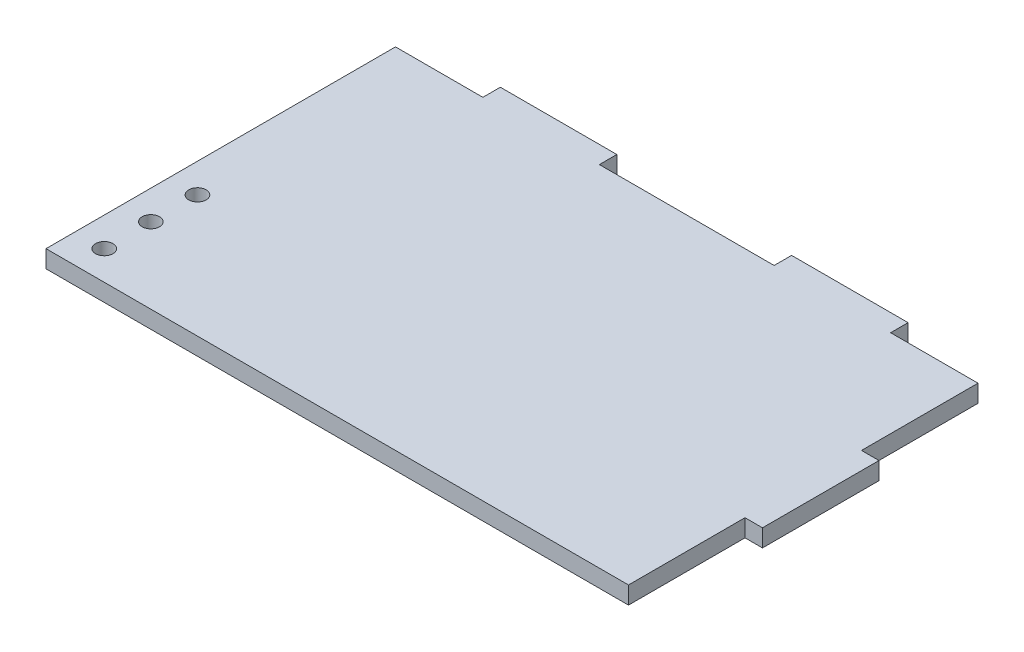
ISO-10303-21;
HEADER;
FILE_DESCRIPTION(('STEP AP214'),'2;1');
FILE_NAME('part.step','',(''),(''),'','','');
FILE_SCHEMA(('AUTOMOTIVE_DESIGN { 1 0 10303 214 1 1 1 1 }'));
ENDSEC;
DATA;
#1=APPLICATION_CONTEXT('core data for automotive mechanical design processes');
#2=APPLICATION_PROTOCOL_DEFINITION('international standard','automotive_design',2000,#1);
#3=PRODUCT_CONTEXT('',#1,'mechanical');
#4=PRODUCT('Part','Part','',(#3));
#5=PRODUCT_RELATED_PRODUCT_CATEGORY('part','',(#4));
#6=PRODUCT_DEFINITION_FORMATION('','',#4);
#7=PRODUCT_DEFINITION_CONTEXT('part definition',#1,'design');
#8=PRODUCT_DEFINITION('design','',#6,#7);
#9=PRODUCT_DEFINITION_SHAPE('','',#8);
#10=(LENGTH_UNIT() NAMED_UNIT(*) SI_UNIT(.MILLI.,.METRE.));
#11=(NAMED_UNIT(*) PLANE_ANGLE_UNIT() SI_UNIT($,.RADIAN.));
#12=(NAMED_UNIT(*) SI_UNIT($,.STERADIAN.) SOLID_ANGLE_UNIT());
#13=UNCERTAINTY_MEASURE_WITH_UNIT(LENGTH_MEASURE(1.E-05),#10,'distance_accuracy_value','');
#14=(GEOMETRIC_REPRESENTATION_CONTEXT(3) GLOBAL_UNCERTAINTY_ASSIGNED_CONTEXT((#13)) GLOBAL_UNIT_ASSIGNED_CONTEXT((#10,
#11,#12)) REPRESENTATION_CONTEXT('',''));
#15=CARTESIAN_POINT('',(0.,0.,0.));
#16=DIRECTION('',(0.,0.,1.));
#17=DIRECTION('',(1.,0.,0.));
#18=AXIS2_PLACEMENT_3D('',#15,#16,#17);
#19=CARTESIAN_POINT('',(0.,94.5,0.));
#20=DIRECTION('',(0.,1.,0.));
#21=DIRECTION('',(0.,0.,1.));
#22=AXIS2_PLACEMENT_3D('',#19,#20,#21);
#23=PLANE('',#22);
#24=CARTESIAN_POINT('',(6.99999999999994,94.5,-152.));
#25=DIRECTION('',(0.,1.,0.));
#26=DIRECTION('',(0.,0.,1.));
#27=AXIS2_PLACEMENT_3D('',#24,#25,#26);
#28=CIRCLE('',#27,1.5);
#29=CARTESIAN_POINT('',(6.99999999999994,94.5,-150.5));
#30=VERTEX_POINT('',#29);
#31=EDGE_CURVE('E337',#30,#30,#28,.T.);
#32=ORIENTED_EDGE('',*,*,#31,.F.);
#33=EDGE_LOOP('',(#32));
#34=FACE_BOUND('',#33,.T.);
#35=DIRECTION('',(0.,0.,-1.));
#36=VECTOR('',#35,1.);
#37=CARTESIAN_POINT('',(102.,94.5,-207.));
#38=LINE('',#37,#36);
#39=CARTESIAN_POINT('',(102.,94.5,-187.));
#40=VERTEX_POINT('',#39);
#41=CARTESIAN_POINT('',(102.,94.5,-207.));
#42=VERTEX_POINT('',#41);
#43=EDGE_CURVE('E208',#40,#42,#38,.T.);
#44=ORIENTED_EDGE('',*,*,#43,.T.);
#45=DIRECTION('',(-1.,0.,0.));
#46=VECTOR('',#45,1.);
#47=CARTESIAN_POINT('',(102.,94.5,-207.));
#48=LINE('',#47,#46);
#49=CARTESIAN_POINT('',(86.9999999999999,94.5,-207.));
#50=VERTEX_POINT('',#49);
#51=EDGE_CURVE('E116',#42,#50,#48,.T.);
#52=ORIENTED_EDGE('',*,*,#51,.T.);
#53=DIRECTION('',(0.,0.,-1.));
#54=VECTOR('',#53,1.);
#55=CARTESIAN_POINT('',(86.9999999999999,94.5,-207.));
#56=LINE('',#55,#54);
#57=CARTESIAN_POINT('',(86.9999999999999,94.5,-210.));
#58=VERTEX_POINT('',#57);
#59=EDGE_CURVE('E247',#50,#58,#56,.T.);
#60=ORIENTED_EDGE('',*,*,#59,.T.);
#61=DIRECTION('',(-1.,0.,0.));
#62=VECTOR('',#61,1.);
#63=CARTESIAN_POINT('',(86.9999999999999,94.5,-210.));
#64=LINE('',#63,#62);
#65=CARTESIAN_POINT('',(66.9999999999999,94.5,-210.));
#66=VERTEX_POINT('',#65);
#67=EDGE_CURVE('E266',#58,#66,#64,.T.);
#68=ORIENTED_EDGE('',*,*,#67,.T.);
#69=DIRECTION('',(0.,0.,1.));
#70=VECTOR('',#69,1.);
#71=CARTESIAN_POINT('',(66.9999999999999,94.5,-207.));
#72=LINE('',#71,#70);
#73=CARTESIAN_POINT('',(66.9999999999999,94.5,-207.));
#74=VERTEX_POINT('',#73);
#75=EDGE_CURVE('E263',#66,#74,#72,.T.);
#76=ORIENTED_EDGE('',*,*,#75,.T.);
#77=DIRECTION('',(-1.,0.,0.));
#78=VECTOR('',#77,1.);
#79=CARTESIAN_POINT('',(66.9999999999999,94.5,-207.));
#80=LINE('',#79,#78);
#81=CARTESIAN_POINT('',(36.9999999999999,94.5,-207.));
#82=VERTEX_POINT('',#81);
#83=EDGE_CURVE('E265',#74,#82,#80,.T.);
#84=ORIENTED_EDGE('',*,*,#83,.T.);
#85=DIRECTION('',(0.,0.,-1.));
#86=VECTOR('',#85,1.);
#87=CARTESIAN_POINT('',(36.9999999999999,94.5,-207.));
#88=LINE('',#87,#86);
#89=CARTESIAN_POINT('',(36.9999999999999,94.5,-210.));
#90=VERTEX_POINT('',#89);
#91=EDGE_CURVE('E268',#82,#90,#88,.T.);
#92=ORIENTED_EDGE('',*,*,#91,.T.);
#93=DIRECTION('',(-1.,0.,0.));
#94=VECTOR('',#93,1.);
#95=CARTESIAN_POINT('',(16.9999999999999,94.5,-210.));
#96=LINE('',#95,#94);
#97=CARTESIAN_POINT('',(16.9999999999999,94.5,-210.));
#98=VERTEX_POINT('',#97);
#99=EDGE_CURVE('E274',#90,#98,#96,.T.);
#100=ORIENTED_EDGE('',*,*,#99,.T.);
#101=DIRECTION('',(0.,0.,1.));
#102=VECTOR('',#101,1.);
#103=CARTESIAN_POINT('',(16.9999999999999,94.5,-207.));
#104=LINE('',#103,#102);
#105=CARTESIAN_POINT('',(16.9999999999999,94.5,-207.));
#106=VERTEX_POINT('',#105);
#107=EDGE_CURVE('E276',#98,#106,#104,.T.);
#108=ORIENTED_EDGE('',*,*,#107,.T.);
#109=DIRECTION('',(-1.,0.,0.));
#110=VECTOR('',#109,1.);
#111=CARTESIAN_POINT('',(16.9999999999999,94.5,-207.));
#112=LINE('',#111,#110);
#113=CARTESIAN_POINT('',(1.99999999999993,94.5,-207.));
#114=VERTEX_POINT('',#113);
#115=EDGE_CURVE('E278',#106,#114,#112,.T.);
#116=ORIENTED_EDGE('',*,*,#115,.T.);
#117=DIRECTION('',(0.,0.,1.));
#118=VECTOR('',#117,1.);
#119=CARTESIAN_POINT('',(1.99999999999993,94.5,-207.));
#120=LINE('',#119,#118);
#121=CARTESIAN_POINT('',(1.99999999999993,94.5,-147.));
#122=VERTEX_POINT('',#121);
#123=EDGE_CURVE('E280',#114,#122,#120,.T.);
#124=ORIENTED_EDGE('',*,*,#123,.T.);
#125=DIRECTION('',(1.,0.,0.));
#126=VECTOR('',#125,1.);
#127=CARTESIAN_POINT('',(102.,94.5,-147.));
#128=LINE('',#127,#126);
#129=CARTESIAN_POINT('',(102.,94.5,-147.));
#130=VERTEX_POINT('',#129);
#131=EDGE_CURVE('E282',#122,#130,#128,.T.);
#132=ORIENTED_EDGE('',*,*,#131,.T.);
#133=DIRECTION('',(0.,0.,-1.));
#134=VECTOR('',#133,1.);
#135=CARTESIAN_POINT('',(102.,94.5,-167.));
#136=LINE('',#135,#134);
#137=CARTESIAN_POINT('',(102.,94.5,-167.));
#138=VERTEX_POINT('',#137);
#139=EDGE_CURVE('E159',#130,#138,#136,.T.);
#140=ORIENTED_EDGE('',*,*,#139,.T.);
#141=DIRECTION('',(1.,0.,0.));
#142=VECTOR('',#141,1.);
#143=CARTESIAN_POINT('',(102.,94.5,-167.));
#144=LINE('',#143,#142);
#145=CARTESIAN_POINT('',(105.,94.5,-167.));
#146=VERTEX_POINT('',#145);
#147=EDGE_CURVE('E153',#138,#146,#144,.T.);
#148=ORIENTED_EDGE('',*,*,#147,.T.);
#149=DIRECTION('',(0.,0.,-1.));
#150=VECTOR('',#149,1.);
#151=CARTESIAN_POINT('',(105.,94.5,-187.));
#152=LINE('',#151,#150);
#153=CARTESIAN_POINT('',(105.,94.5,-187.));
#154=VERTEX_POINT('',#153);
#155=EDGE_CURVE('E157',#146,#154,#152,.T.);
#156=ORIENTED_EDGE('',*,*,#155,.T.);
#157=DIRECTION('',(-1.,0.,0.));
#158=VECTOR('',#157,1.);
#159=CARTESIAN_POINT('',(102.,94.5,-187.));
#160=LINE('',#159,#158);
#161=EDGE_CURVE('E49',#154,#40,#160,.T.);
#162=ORIENTED_EDGE('',*,*,#161,.T.);
#163=EDGE_LOOP('',(#44,#52,#60,#68,#76,#84,#92,#100,#108,#116,#124,#132,#140,#148,#156,#162));
#164=FACE_BOUND('',#163,.T.);
#165=CARTESIAN_POINT('',(6.99999999999992,94.5,-160.));
#166=DIRECTION('',(0.,1.,0.));
#167=DIRECTION('',(0.,0.,1.));
#168=AXIS2_PLACEMENT_3D('',#165,#166,#167);
#169=CIRCLE('',#168,1.5);
#170=CARTESIAN_POINT('',(6.99999999999992,94.5,-158.5));
#171=VERTEX_POINT('',#170);
#172=EDGE_CURVE('E181',#171,#171,#169,.T.);
#173=ORIENTED_EDGE('',*,*,#172,.F.);
#174=EDGE_LOOP('',(#173));
#175=FACE_BOUND('',#174,.T.);
#176=CARTESIAN_POINT('',(6.99999999999992,94.5,-168.));
#177=DIRECTION('',(0.,1.,0.));
#178=DIRECTION('',(0.,0.,1.));
#179=AXIS2_PLACEMENT_3D('',#176,#177,#178);
#180=CIRCLE('',#179,1.5);
#181=CARTESIAN_POINT('',(6.99999999999992,94.5,-166.5));
#182=VERTEX_POINT('',#181);
#183=EDGE_CURVE('E328',#182,#182,#180,.T.);
#184=ORIENTED_EDGE('',*,*,#183,.F.);
#185=EDGE_LOOP('',(#184));
#186=FACE_BOUND('',#185,.T.);
#187=ADVANCED_FACE('F32',(#34,#164,#175,#186),#23,.T.);
#188=CARTESIAN_POINT('',(0.,91.5,0.));
#189=DIRECTION('',(0.,1.,0.));
#190=DIRECTION('',(0.,0.,1.));
#191=AXIS2_PLACEMENT_3D('',#188,#189,#190);
#192=PLANE('',#191);
#193=DIRECTION('',(0.,0.,-1.));
#194=VECTOR('',#193,1.);
#195=CARTESIAN_POINT('',(102.,91.5,-207.));
#196=LINE('',#195,#194);
#197=CARTESIAN_POINT('',(102.,91.5,-187.));
#198=VERTEX_POINT('',#197);
#199=CARTESIAN_POINT('',(102.,91.5,-207.));
#200=VERTEX_POINT('',#199);
#201=EDGE_CURVE('E177',#198,#200,#196,.T.);
#202=ORIENTED_EDGE('',*,*,#201,.F.);
#203=DIRECTION('',(-1.,0.,0.));
#204=VECTOR('',#203,1.);
#205=CARTESIAN_POINT('',(102.,91.5,-187.));
#206=LINE('',#205,#204);
#207=CARTESIAN_POINT('',(105.,91.5,-187.));
#208=VERTEX_POINT('',#207);
#209=EDGE_CURVE('E108',#208,#198,#206,.T.);
#210=ORIENTED_EDGE('',*,*,#209,.F.);
#211=DIRECTION('',(0.,0.,-1.));
#212=VECTOR('',#211,1.);
#213=CARTESIAN_POINT('',(105.,91.5,-187.));
#214=LINE('',#213,#212);
#215=CARTESIAN_POINT('',(105.,91.5,-167.));
#216=VERTEX_POINT('',#215);
#217=EDGE_CURVE('E102',#216,#208,#214,.T.);
#218=ORIENTED_EDGE('',*,*,#217,.F.);
#219=DIRECTION('',(1.,0.,0.));
#220=VECTOR('',#219,1.);
#221=CARTESIAN_POINT('',(102.,91.5,-167.));
#222=LINE('',#221,#220);
#223=CARTESIAN_POINT('',(102.,91.5,-167.));
#224=VERTEX_POINT('',#223);
#225=EDGE_CURVE('E167',#224,#216,#222,.T.);
#226=ORIENTED_EDGE('',*,*,#225,.F.);
#227=DIRECTION('',(0.,0.,-1.));
#228=VECTOR('',#227,1.);
#229=CARTESIAN_POINT('',(102.,91.5,-167.));
#230=LINE('',#229,#228);
#231=CARTESIAN_POINT('',(102.,91.5,-147.));
#232=VERTEX_POINT('',#231);
#233=EDGE_CURVE('E203',#232,#224,#230,.T.);
#234=ORIENTED_EDGE('',*,*,#233,.F.);
#235=DIRECTION('',(1.,0.,0.));
#236=VECTOR('',#235,1.);
#237=CARTESIAN_POINT('',(102.,91.5,-147.));
#238=LINE('',#237,#236);
#239=CARTESIAN_POINT('',(1.99999999999993,91.5,-147.));
#240=VERTEX_POINT('',#239);
#241=EDGE_CURVE('E201',#240,#232,#238,.T.);
#242=ORIENTED_EDGE('',*,*,#241,.F.);
#243=DIRECTION('',(0.,0.,1.));
#244=VECTOR('',#243,1.);
#245=CARTESIAN_POINT('',(1.99999999999993,91.5,-207.));
#246=LINE('',#245,#244);
#247=CARTESIAN_POINT('',(1.99999999999993,91.5,-207.));
#248=VERTEX_POINT('',#247);
#249=EDGE_CURVE('E199',#248,#240,#246,.T.);
#250=ORIENTED_EDGE('',*,*,#249,.F.);
#251=DIRECTION('',(-1.,0.,0.));
#252=VECTOR('',#251,1.);
#253=CARTESIAN_POINT('',(16.9999999999999,91.5,-207.));
#254=LINE('',#253,#252);
#255=CARTESIAN_POINT('',(16.9999999999999,91.5,-207.));
#256=VERTEX_POINT('',#255);
#257=EDGE_CURVE('E197',#256,#248,#254,.T.);
#258=ORIENTED_EDGE('',*,*,#257,.F.);
#259=DIRECTION('',(0.,0.,1.));
#260=VECTOR('',#259,1.);
#261=CARTESIAN_POINT('',(16.9999999999999,91.5,-207.));
#262=LINE('',#261,#260);
#263=CARTESIAN_POINT('',(16.9999999999999,91.5,-210.));
#264=VERTEX_POINT('',#263);
#265=EDGE_CURVE('E195',#264,#256,#262,.T.);
#266=ORIENTED_EDGE('',*,*,#265,.F.);
#267=DIRECTION('',(-1.,0.,0.));
#268=VECTOR('',#267,1.);
#269=CARTESIAN_POINT('',(16.9999999999999,91.5,-210.));
#270=LINE('',#269,#268);
#271=CARTESIAN_POINT('',(36.9999999999999,91.5,-210.));
#272=VERTEX_POINT('',#271);
#273=EDGE_CURVE('E193',#272,#264,#270,.T.);
#274=ORIENTED_EDGE('',*,*,#273,.F.);
#275=DIRECTION('',(0.,0.,-1.));
#276=VECTOR('',#275,1.);
#277=CARTESIAN_POINT('',(36.9999999999999,91.5,-207.));
#278=LINE('',#277,#276);
#279=CARTESIAN_POINT('',(36.9999999999999,91.5,-207.));
#280=VERTEX_POINT('',#279);
#281=EDGE_CURVE('E191',#280,#272,#278,.T.);
#282=ORIENTED_EDGE('',*,*,#281,.F.);
#283=DIRECTION('',(-1.,0.,0.));
#284=VECTOR('',#283,1.);
#285=CARTESIAN_POINT('',(66.9999999999999,91.5,-207.));
#286=LINE('',#285,#284);
#287=CARTESIAN_POINT('',(66.9999999999999,91.5,-207.));
#288=VERTEX_POINT('',#287);
#289=EDGE_CURVE('E189',#288,#280,#286,.T.);
#290=ORIENTED_EDGE('',*,*,#289,.F.);
#291=DIRECTION('',(0.,0.,1.));
#292=VECTOR('',#291,1.);
#293=CARTESIAN_POINT('',(66.9999999999999,91.5,-207.));
#294=LINE('',#293,#292);
#295=CARTESIAN_POINT('',(66.9999999999999,91.5,-210.));
#296=VERTEX_POINT('',#295);
#297=EDGE_CURVE('E187',#296,#288,#294,.T.);
#298=ORIENTED_EDGE('',*,*,#297,.F.);
#299=DIRECTION('',(-1.,0.,0.));
#300=VECTOR('',#299,1.);
#301=CARTESIAN_POINT('',(86.9999999999999,91.5,-210.));
#302=LINE('',#301,#300);
#303=CARTESIAN_POINT('',(86.9999999999999,91.5,-210.));
#304=VERTEX_POINT('',#303);
#305=EDGE_CURVE('E185',#304,#296,#302,.T.);
#306=ORIENTED_EDGE('',*,*,#305,.F.);
#307=DIRECTION('',(0.,0.,-1.));
#308=VECTOR('',#307,1.);
#309=CARTESIAN_POINT('',(86.9999999999999,91.5,-207.));
#310=LINE('',#309,#308);
#311=CARTESIAN_POINT('',(86.9999999999999,91.5,-207.));
#312=VERTEX_POINT('',#311);
#313=EDGE_CURVE('E183',#312,#304,#310,.T.);
#314=ORIENTED_EDGE('',*,*,#313,.F.);
#315=DIRECTION('',(-1.,0.,0.));
#316=VECTOR('',#315,1.);
#317=CARTESIAN_POINT('',(102.,91.5,-207.));
#318=LINE('',#317,#316);
#319=EDGE_CURVE('E180',#200,#312,#318,.T.);
#320=ORIENTED_EDGE('',*,*,#319,.F.);
#321=EDGE_LOOP('',(#202,#210,#218,#226,#234,#242,#250,#258,#266,#274,#282,#290,#298,#306,#314,#320));
#322=FACE_BOUND('',#321,.T.);
#323=CARTESIAN_POINT('',(6.99999999999992,91.5,-160.));
#324=DIRECTION('',(0.,1.,0.));
#325=DIRECTION('',(0.,0.,1.));
#326=AXIS2_PLACEMENT_3D('',#323,#324,#325);
#327=CIRCLE('',#326,1.5);
#328=CARTESIAN_POINT('',(6.99999999999992,91.5,-158.5));
#329=VERTEX_POINT('',#328);
#330=EDGE_CURVE('E340',#329,#329,#327,.T.);
#331=ORIENTED_EDGE('',*,*,#330,.T.);
#332=EDGE_LOOP('',(#331));
#333=FACE_BOUND('',#332,.T.);
#334=CARTESIAN_POINT('',(6.99999999999994,91.5,-152.));
#335=DIRECTION('',(0.,1.,0.));
#336=DIRECTION('',(0.,0.,1.));
#337=AXIS2_PLACEMENT_3D('',#334,#335,#336);
#338=CIRCLE('',#337,1.5);
#339=CARTESIAN_POINT('',(6.99999999999994,91.5,-150.5));
#340=VERTEX_POINT('',#339);
#341=EDGE_CURVE('E334',#340,#340,#338,.T.);
#342=ORIENTED_EDGE('',*,*,#341,.T.);
#343=EDGE_LOOP('',(#342));
#344=FACE_BOUND('',#343,.T.);
#345=CARTESIAN_POINT('',(6.99999999999992,91.5,-168.));
#346=DIRECTION('',(0.,1.,0.));
#347=DIRECTION('',(0.,0.,1.));
#348=AXIS2_PLACEMENT_3D('',#345,#346,#347);
#349=CIRCLE('',#348,1.5);
#350=CARTESIAN_POINT('',(6.99999999999992,91.5,-166.5));
#351=VERTEX_POINT('',#350);
#352=EDGE_CURVE('E331',#351,#351,#349,.T.);
#353=ORIENTED_EDGE('',*,*,#352,.T.);
#354=EDGE_LOOP('',(#353));
#355=FACE_BOUND('',#354,.T.);
#356=ADVANCED_FACE('F251',(#322,#333,#344,#355),#192,.F.);
#357=CARTESIAN_POINT('',(102.,94.5,-207.));
#358=DIRECTION('',(-1.,0.,0.));
#359=DIRECTION('',(0.,0.,1.));
#360=AXIS2_PLACEMENT_3D('',#357,#358,#359);
#361=PLANE('',#360);
#362=ORIENTED_EDGE('',*,*,#201,.T.);
#363=DIRECTION('',(0.,-1.,0.));
#364=VECTOR('',#363,1.);
#365=CARTESIAN_POINT('',(102.,94.5,-207.));
#366=LINE('',#365,#364);
#367=EDGE_CURVE('E11',#42,#200,#366,.T.);
#368=ORIENTED_EDGE('',*,*,#367,.F.);
#369=ORIENTED_EDGE('',*,*,#43,.F.);
#370=DIRECTION('',(0.,-1.,0.));
#371=VECTOR('',#370,1.);
#372=CARTESIAN_POINT('',(102.,94.5,-187.));
#373=LINE('',#372,#371);
#374=EDGE_CURVE('E173',#40,#198,#373,.T.);
#375=ORIENTED_EDGE('',*,*,#374,.T.);
#376=EDGE_LOOP('',(#362,#368,#369,#375));
#377=FACE_BOUND('',#376,.T.);
#378=ADVANCED_FACE('F34',(#377),#361,.F.);
#379=CARTESIAN_POINT('',(102.,94.5,-207.));
#380=DIRECTION('',(0.,0.,1.));
#381=DIRECTION('',(1.,0.,0.));
#382=AXIS2_PLACEMENT_3D('',#379,#380,#381);
#383=PLANE('',#382);
#384=ORIENTED_EDGE('',*,*,#319,.T.);
#385=DIRECTION('',(0.,-1.,0.));
#386=VECTOR('',#385,1.);
#387=CARTESIAN_POINT('',(86.9999999999999,94.5,-207.));
#388=LINE('',#387,#386);
#389=EDGE_CURVE('E41',#50,#312,#388,.T.);
#390=ORIENTED_EDGE('',*,*,#389,.F.);
#391=ORIENTED_EDGE('',*,*,#51,.F.);
#392=ORIENTED_EDGE('',*,*,#367,.T.);
#393=EDGE_LOOP('',(#384,#390,#391,#392));
#394=FACE_BOUND('',#393,.T.);
#395=ADVANCED_FACE('F486',(#394),#383,.F.);
#396=CARTESIAN_POINT('',(86.9999999999999,94.5,-207.));
#397=DIRECTION('',(-1.,0.,0.));
#398=DIRECTION('',(0.,0.,1.));
#399=AXIS2_PLACEMENT_3D('',#396,#397,#398);
#400=PLANE('',#399);
#401=ORIENTED_EDGE('',*,*,#313,.T.);
#402=DIRECTION('',(0.,-1.,0.));
#403=VECTOR('',#402,1.);
#404=CARTESIAN_POINT('',(86.9999999999999,94.5,-210.));
#405=LINE('',#404,#403);
#406=EDGE_CURVE('E239',#58,#304,#405,.T.);
#407=ORIENTED_EDGE('',*,*,#406,.F.);
#408=ORIENTED_EDGE('',*,*,#59,.F.);
#409=ORIENTED_EDGE('',*,*,#389,.T.);
#410=EDGE_LOOP('',(#401,#407,#408,#409));
#411=FACE_BOUND('',#410,.T.);
#412=ADVANCED_FACE('F245',(#411),#400,.F.);
#413=CARTESIAN_POINT('',(86.9999999999999,94.5,-210.));
#414=DIRECTION('',(0.,0.,1.));
#415=DIRECTION('',(1.,0.,0.));
#416=AXIS2_PLACEMENT_3D('',#413,#414,#415);
#417=PLANE('',#416);
#418=ORIENTED_EDGE('',*,*,#305,.T.);
#419=DIRECTION('',(0.,-1.,0.));
#420=VECTOR('',#419,1.);
#421=CARTESIAN_POINT('',(66.9999999999999,94.5,-210.));
#422=LINE('',#421,#420);
#423=EDGE_CURVE('E236',#66,#296,#422,.T.);
#424=ORIENTED_EDGE('',*,*,#423,.F.);
#425=ORIENTED_EDGE('',*,*,#67,.F.);
#426=ORIENTED_EDGE('',*,*,#406,.T.);
#427=EDGE_LOOP('',(#418,#424,#425,#426));
#428=FACE_BOUND('',#427,.T.);
#429=ADVANCED_FACE('F257',(#428),#417,.F.);
#430=CARTESIAN_POINT('',(66.9999999999999,94.5,-207.));
#431=DIRECTION('',(1.,0.,0.));
#432=DIRECTION('',(0.,0.,-1.));
#433=AXIS2_PLACEMENT_3D('',#430,#431,#432);
#434=PLANE('',#433);
#435=ORIENTED_EDGE('',*,*,#297,.T.);
#436=DIRECTION('',(0.,-1.,0.));
#437=VECTOR('',#436,1.);
#438=CARTESIAN_POINT('',(66.9999999999999,94.5,-207.));
#439=LINE('',#438,#437);
#440=EDGE_CURVE('E233',#74,#288,#439,.T.);
#441=ORIENTED_EDGE('',*,*,#440,.F.);
#442=ORIENTED_EDGE('',*,*,#75,.F.);
#443=ORIENTED_EDGE('',*,*,#423,.T.);
#444=EDGE_LOOP('',(#435,#441,#442,#443));
#445=FACE_BOUND('',#444,.T.);
#446=ADVANCED_FACE('F261',(#445),#434,.F.);
#447=CARTESIAN_POINT('',(66.9999999999999,94.5,-207.));
#448=DIRECTION('',(0.,0.,1.));
#449=DIRECTION('',(1.,0.,0.));
#450=AXIS2_PLACEMENT_3D('',#447,#448,#449);
#451=PLANE('',#450);
#452=ORIENTED_EDGE('',*,*,#289,.T.);
#453=DIRECTION('',(0.,-1.,0.));
#454=VECTOR('',#453,1.);
#455=CARTESIAN_POINT('',(36.9999999999999,94.5,-207.));
#456=LINE('',#455,#454);
#457=EDGE_CURVE('E230',#82,#280,#456,.T.);
#458=ORIENTED_EDGE('',*,*,#457,.F.);
#459=ORIENTED_EDGE('',*,*,#83,.F.);
#460=ORIENTED_EDGE('',*,*,#440,.T.);
#461=EDGE_LOOP('',(#452,#458,#459,#460));
#462=FACE_BOUND('',#461,.T.);
#463=ADVANCED_FACE('F451',(#462),#451,.F.);
#464=CARTESIAN_POINT('',(36.9999999999999,94.5,-207.));
#465=DIRECTION('',(-1.,0.,0.));
#466=DIRECTION('',(0.,0.,1.));
#467=AXIS2_PLACEMENT_3D('',#464,#465,#466);
#468=PLANE('',#467);
#469=ORIENTED_EDGE('',*,*,#281,.T.);
#470=DIRECTION('',(0.,-1.,0.));
#471=VECTOR('',#470,1.);
#472=CARTESIAN_POINT('',(36.9999999999999,94.5,-210.));
#473=LINE('',#472,#471);
#474=EDGE_CURVE('E227',#90,#272,#473,.T.);
#475=ORIENTED_EDGE('',*,*,#474,.F.);
#476=ORIENTED_EDGE('',*,*,#91,.F.);
#477=ORIENTED_EDGE('',*,*,#457,.T.);
#478=EDGE_LOOP('',(#469,#475,#476,#477));
#479=FACE_BOUND('',#478,.T.);
#480=ADVANCED_FACE('F441',(#479),#468,.F.);
#481=CARTESIAN_POINT('',(16.9999999999999,94.5,-210.));
#482=DIRECTION('',(0.,0.,1.));
#483=DIRECTION('',(1.,0.,0.));
#484=AXIS2_PLACEMENT_3D('',#481,#482,#483);
#485=PLANE('',#484);
#486=ORIENTED_EDGE('',*,*,#273,.T.);
#487=DIRECTION('',(0.,-1.,0.));
#488=VECTOR('',#487,1.);
#489=CARTESIAN_POINT('',(16.9999999999999,94.5,-210.));
#490=LINE('',#489,#488);
#491=EDGE_CURVE('E224',#98,#264,#490,.T.);
#492=ORIENTED_EDGE('',*,*,#491,.F.);
#493=ORIENTED_EDGE('',*,*,#99,.F.);
#494=ORIENTED_EDGE('',*,*,#474,.T.);
#495=EDGE_LOOP('',(#486,#492,#493,#494));
#496=FACE_BOUND('',#495,.T.);
#497=ADVANCED_FACE('F431',(#496),#485,.F.);
#498=CARTESIAN_POINT('',(16.9999999999999,94.5,-207.));
#499=DIRECTION('',(1.,0.,0.));
#500=DIRECTION('',(0.,0.,-1.));
#501=AXIS2_PLACEMENT_3D('',#498,#499,#500);
#502=PLANE('',#501);
#503=ORIENTED_EDGE('',*,*,#265,.T.);
#504=DIRECTION('',(0.,-1.,0.));
#505=VECTOR('',#504,1.);
#506=CARTESIAN_POINT('',(16.9999999999999,94.5,-207.));
#507=LINE('',#506,#505);
#508=EDGE_CURVE('E221',#106,#256,#507,.T.);
#509=ORIENTED_EDGE('',*,*,#508,.F.);
#510=ORIENTED_EDGE('',*,*,#107,.F.);
#511=ORIENTED_EDGE('',*,*,#491,.T.);
#512=EDGE_LOOP('',(#503,#509,#510,#511));
#513=FACE_BOUND('',#512,.T.);
#514=ADVANCED_FACE('F421',(#513),#502,.F.);
#515=CARTESIAN_POINT('',(16.9999999999999,94.5,-207.));
#516=DIRECTION('',(0.,0.,1.));
#517=DIRECTION('',(1.,0.,0.));
#518=AXIS2_PLACEMENT_3D('',#515,#516,#517);
#519=PLANE('',#518);
#520=ORIENTED_EDGE('',*,*,#257,.T.);
#521=DIRECTION('',(0.,-1.,0.));
#522=VECTOR('',#521,1.);
#523=CARTESIAN_POINT('',(1.99999999999993,94.5,-207.));
#524=LINE('',#523,#522);
#525=EDGE_CURVE('E218',#114,#248,#524,.T.);
#526=ORIENTED_EDGE('',*,*,#525,.F.);
#527=ORIENTED_EDGE('',*,*,#115,.F.);
#528=ORIENTED_EDGE('',*,*,#508,.T.);
#529=EDGE_LOOP('',(#520,#526,#527,#528));
#530=FACE_BOUND('',#529,.T.);
#531=ADVANCED_FACE('F411',(#530),#519,.F.);
#532=CARTESIAN_POINT('',(1.99999999999993,94.5,-207.));
#533=DIRECTION('',(1.,0.,0.));
#534=DIRECTION('',(0.,0.,-1.));
#535=AXIS2_PLACEMENT_3D('',#532,#533,#534);
#536=PLANE('',#535);
#537=ORIENTED_EDGE('',*,*,#249,.T.);
#538=DIRECTION('',(0.,-1.,0.));
#539=VECTOR('',#538,1.);
#540=CARTESIAN_POINT('',(1.99999999999993,94.5,-147.));
#541=LINE('',#540,#539);
#542=EDGE_CURVE('E215',#122,#240,#541,.T.);
#543=ORIENTED_EDGE('',*,*,#542,.F.);
#544=ORIENTED_EDGE('',*,*,#123,.F.);
#545=ORIENTED_EDGE('',*,*,#525,.T.);
#546=EDGE_LOOP('',(#537,#543,#544,#545));
#547=FACE_BOUND('',#546,.T.);
#548=ADVANCED_FACE('F402',(#547),#536,.F.);
#549=CARTESIAN_POINT('',(102.,94.5,-147.));
#550=DIRECTION('',(0.,0.,-1.));
#551=DIRECTION('',(-1.,0.,0.));
#552=AXIS2_PLACEMENT_3D('',#549,#550,#551);
#553=PLANE('',#552);
#554=ORIENTED_EDGE('',*,*,#241,.T.);
#555=DIRECTION('',(0.,-1.,0.));
#556=VECTOR('',#555,1.);
#557=CARTESIAN_POINT('',(102.,94.5,-147.));
#558=LINE('',#557,#556);
#559=EDGE_CURVE('E212',#130,#232,#558,.T.);
#560=ORIENTED_EDGE('',*,*,#559,.F.);
#561=ORIENTED_EDGE('',*,*,#131,.F.);
#562=ORIENTED_EDGE('',*,*,#542,.T.);
#563=EDGE_LOOP('',(#554,#560,#561,#562));
#564=FACE_BOUND('',#563,.T.);
#565=ADVANCED_FACE('F288',(#564),#553,.F.);
#566=CARTESIAN_POINT('',(102.,94.5,-167.));
#567=DIRECTION('',(-1.,0.,0.));
#568=DIRECTION('',(0.,0.,1.));
#569=AXIS2_PLACEMENT_3D('',#566,#567,#568);
#570=PLANE('',#569);
#571=ORIENTED_EDGE('',*,*,#233,.T.);
#572=DIRECTION('',(0.,-1.,0.));
#573=VECTOR('',#572,1.);
#574=CARTESIAN_POINT('',(102.,94.5,-167.));
#575=LINE('',#574,#573);
#576=EDGE_CURVE('E168',#138,#224,#575,.T.);
#577=ORIENTED_EDGE('',*,*,#576,.F.);
#578=ORIENTED_EDGE('',*,*,#139,.F.);
#579=ORIENTED_EDGE('',*,*,#559,.T.);
#580=EDGE_LOOP('',(#571,#577,#578,#579));
#581=FACE_BOUND('',#580,.T.);
#582=ADVANCED_FACE('F292',(#581),#570,.F.);
#583=CARTESIAN_POINT('',(102.,94.5,-167.));
#584=DIRECTION('',(0.,0.,-1.));
#585=DIRECTION('',(-1.,0.,0.));
#586=AXIS2_PLACEMENT_3D('',#583,#584,#585);
#587=PLANE('',#586);
#588=ORIENTED_EDGE('',*,*,#225,.T.);
#589=DIRECTION('',(0.,-1.,0.));
#590=VECTOR('',#589,1.);
#591=CARTESIAN_POINT('',(105.,94.5,-167.));
#592=LINE('',#591,#590);
#593=EDGE_CURVE('E164',#146,#216,#592,.T.);
#594=ORIENTED_EDGE('',*,*,#593,.F.);
#595=ORIENTED_EDGE('',*,*,#147,.F.);
#596=ORIENTED_EDGE('',*,*,#576,.T.);
#597=EDGE_LOOP('',(#588,#594,#595,#596));
#598=FACE_BOUND('',#597,.T.);
#599=ADVANCED_FACE('F165',(#598),#587,.F.);
#600=CARTESIAN_POINT('',(105.,94.5,-187.));
#601=DIRECTION('',(-1.,0.,0.));
#602=DIRECTION('',(0.,0.,1.));
#603=AXIS2_PLACEMENT_3D('',#600,#601,#602);
#604=PLANE('',#603);
#605=ORIENTED_EDGE('',*,*,#217,.T.);
#606=DIRECTION('',(0.,-1.,0.));
#607=VECTOR('',#606,1.);
#608=CARTESIAN_POINT('',(105.,94.5,-187.));
#609=LINE('',#608,#607);
#610=EDGE_CURVE('E169',#154,#208,#609,.T.);
#611=ORIENTED_EDGE('',*,*,#610,.F.);
#612=ORIENTED_EDGE('',*,*,#155,.F.);
#613=ORIENTED_EDGE('',*,*,#593,.T.);
#614=EDGE_LOOP('',(#605,#611,#612,#613));
#615=FACE_BOUND('',#614,.T.);
#616=ADVANCED_FACE('F171',(#615),#604,.F.);
#617=CARTESIAN_POINT('',(102.,94.5,-187.));
#618=DIRECTION('',(0.,0.,1.));
#619=DIRECTION('',(1.,0.,0.));
#620=AXIS2_PLACEMENT_3D('',#617,#618,#619);
#621=PLANE('',#620);
#622=ORIENTED_EDGE('',*,*,#209,.T.);
#623=ORIENTED_EDGE('',*,*,#374,.F.);
#624=ORIENTED_EDGE('',*,*,#161,.F.);
#625=ORIENTED_EDGE('',*,*,#610,.T.);
#626=EDGE_LOOP('',(#622,#623,#624,#625));
#627=FACE_BOUND('',#626,.T.);
#628=ADVANCED_FACE('F296',(#627),#621,.F.);
#629=CARTESIAN_POINT('',(6.99999999999992,94.5,-160.));
#630=DIRECTION('',(0.,-1.,0.));
#631=DIRECTION('',(0.,0.,-1.));
#632=AXIS2_PLACEMENT_3D('',#629,#630,#631);
#633=CYLINDRICAL_SURFACE('',#632,1.5);
#634=ORIENTED_EDGE('',*,*,#172,.T.);
#635=EDGE_LOOP('',(#634));
#636=FACE_BOUND('',#635,.T.);
#637=ORIENTED_EDGE('',*,*,#330,.F.);
#638=EDGE_LOOP('',(#637));
#639=FACE_BOUND('',#638,.T.);
#640=ADVANCED_FACE('F298',(#636,#639),#633,.F.);
#641=CARTESIAN_POINT('',(6.99999999999994,94.5,-152.));
#642=DIRECTION('',(0.,-1.,0.));
#643=DIRECTION('',(0.,0.,-1.));
#644=AXIS2_PLACEMENT_3D('',#641,#642,#643);
#645=CYLINDRICAL_SURFACE('',#644,1.5);
#646=ORIENTED_EDGE('',*,*,#31,.T.);
#647=EDGE_LOOP('',(#646));
#648=FACE_BOUND('',#647,.T.);
#649=ORIENTED_EDGE('',*,*,#341,.F.);
#650=EDGE_LOOP('',(#649));
#651=FACE_BOUND('',#650,.T.);
#652=ADVANCED_FACE('F304',(#648,#651),#645,.F.);
#653=CARTESIAN_POINT('',(6.99999999999992,94.5,-168.));
#654=DIRECTION('',(0.,-1.,0.));
#655=DIRECTION('',(0.,0.,-1.));
#656=AXIS2_PLACEMENT_3D('',#653,#654,#655);
#657=CYLINDRICAL_SURFACE('',#656,1.5);
#658=ORIENTED_EDGE('',*,*,#183,.T.);
#659=EDGE_LOOP('',(#658));
#660=FACE_BOUND('',#659,.T.);
#661=ORIENTED_EDGE('',*,*,#352,.F.);
#662=EDGE_LOOP('',(#661));
#663=FACE_BOUND('',#662,.T.);
#664=ADVANCED_FACE('F319',(#660,#663),#657,.F.);
#665=CLOSED_SHELL('',(#187,#356,#378,#395,#412,#429,#446,#463,#480,#497,#514,#531,#548,#565,
#582,#599,#616,#628,#640,#652,#664));
#666=MANIFOLD_SOLID_BREP('B2',#665);
#667=ADVANCED_BREP_SHAPE_REPRESENTATION('',(#18,#666),#14);
#668=SHAPE_DEFINITION_REPRESENTATION(#9,#667);
ENDSEC;
END-ISO-10303-21;
